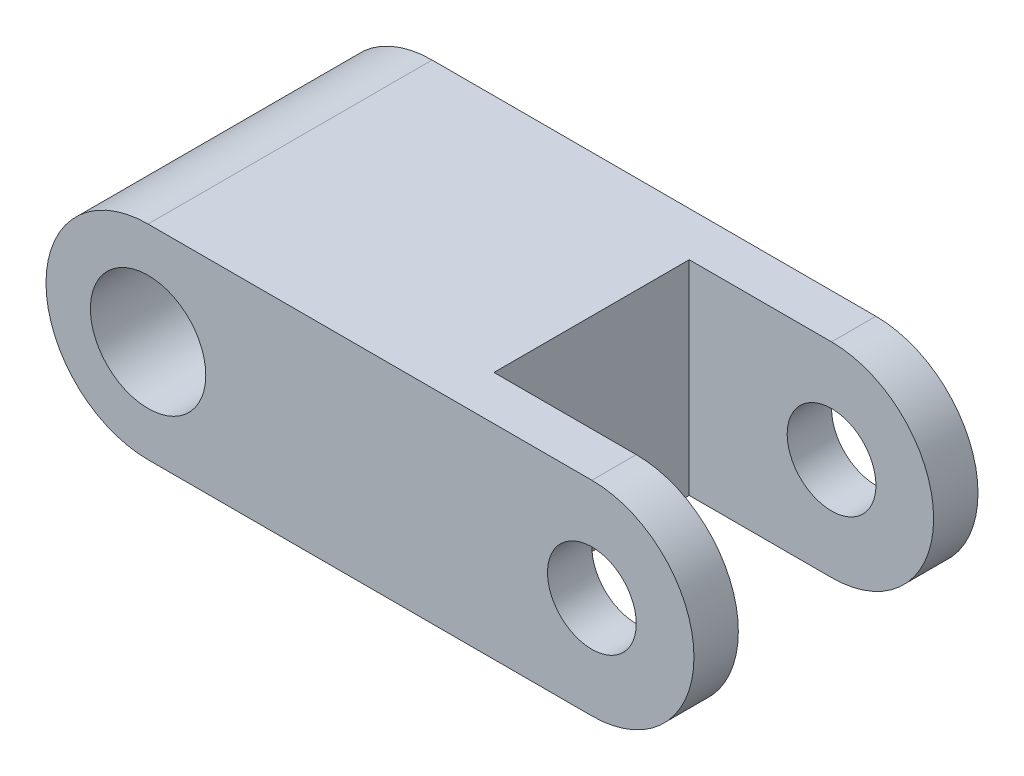
ISO-10303-21;
HEADER;
FILE_DESCRIPTION(('STEP AP214'),'2;1');
FILE_NAME('part.step','',(''),(''),'','','');
FILE_SCHEMA(('AUTOMOTIVE_DESIGN { 1 0 10303 214 1 1 1 1 }'));
ENDSEC;
DATA;
#1=APPLICATION_CONTEXT('core data for automotive mechanical design processes');
#2=APPLICATION_PROTOCOL_DEFINITION('international standard','automotive_design',2000,#1);
#3=PRODUCT_CONTEXT('',#1,'mechanical');
#4=PRODUCT('Part','Part','',(#3));
#5=PRODUCT_RELATED_PRODUCT_CATEGORY('part','',(#4));
#6=PRODUCT_DEFINITION_FORMATION('','',#4);
#7=PRODUCT_DEFINITION_CONTEXT('part definition',#1,'design');
#8=PRODUCT_DEFINITION('design','',#6,#7);
#9=PRODUCT_DEFINITION_SHAPE('','',#8);
#10=(LENGTH_UNIT() NAMED_UNIT(*) SI_UNIT(.MILLI.,.METRE.));
#11=(NAMED_UNIT(*) PLANE_ANGLE_UNIT() SI_UNIT($,.RADIAN.));
#12=(NAMED_UNIT(*) SI_UNIT($,.STERADIAN.) SOLID_ANGLE_UNIT());
#13=UNCERTAINTY_MEASURE_WITH_UNIT(LENGTH_MEASURE(1.E-05),#10,'distance_accuracy_value','');
#14=(GEOMETRIC_REPRESENTATION_CONTEXT(3) GLOBAL_UNCERTAINTY_ASSIGNED_CONTEXT((#13)) GLOBAL_UNIT_ASSIGNED_CONTEXT((#10,
#11,#12)) REPRESENTATION_CONTEXT('',''));
#15=CARTESIAN_POINT('',(0.,0.,0.));
#16=DIRECTION('',(0.,0.,1.));
#17=DIRECTION('',(1.,0.,0.));
#18=AXIS2_PLACEMENT_3D('',#15,#16,#17);
#19=CARTESIAN_POINT('',(50.,0.,32.));
#20=DIRECTION('',(0.,0.,-1.));
#21=DIRECTION('',(-1.,0.,0.));
#22=AXIS2_PLACEMENT_3D('',#19,#20,#21);
#23=CYLINDRICAL_SURFACE('',#22,11.5);
#24=DIRECTION('',(0.,0.,-1.));
#25=VECTOR('',#24,1.);
#26=CARTESIAN_POINT('',(50.,-11.5,32.));
#27=LINE('',#26,#25);
#28=CARTESIAN_POINT('',(50.,-11.5,32.));
#29=VERTEX_POINT('',#28);
#30=CARTESIAN_POINT('',(50.,-11.5,27.));
#31=VERTEX_POINT('',#30);
#32=EDGE_CURVE('E53',#29,#31,#27,.T.);
#33=ORIENTED_EDGE('',*,*,#32,.T.);
#34=CARTESIAN_POINT('',(50.,0.,27.));
#35=DIRECTION('',(0.,0.,1.));
#36=DIRECTION('',(1.,0.,0.));
#37=AXIS2_PLACEMENT_3D('',#34,#35,#36);
#38=CIRCLE('',#37,11.5);
#39=CARTESIAN_POINT('',(50.,11.5,27.));
#40=VERTEX_POINT('',#39);
#41=EDGE_CURVE('E122',#40,#31,#38,.F.);
#42=ORIENTED_EDGE('',*,*,#41,.F.);
#43=DIRECTION('',(0.,0.,-1.));
#44=VECTOR('',#43,1.);
#45=CARTESIAN_POINT('',(50.,11.5,32.));
#46=LINE('',#45,#44);
#47=CARTESIAN_POINT('',(50.,11.5,32.));
#48=VERTEX_POINT('',#47);
#49=EDGE_CURVE('E135',#48,#40,#46,.T.);
#50=ORIENTED_EDGE('',*,*,#49,.F.);
#51=CARTESIAN_POINT('',(50.,0.,32.));
#52=DIRECTION('',(0.,0.,1.));
#53=DIRECTION('',(1.,0.,0.));
#54=AXIS2_PLACEMENT_3D('',#51,#52,#53);
#55=CIRCLE('',#54,11.5);
#56=EDGE_CURVE('E158',#29,#48,#55,.T.);
#57=ORIENTED_EDGE('',*,*,#56,.F.);
#58=EDGE_LOOP('',(#33,#42,#50,#57));
#59=FACE_BOUND('',#58,.T.);
#60=ADVANCED_FACE('F45',(#59),#23,.T.);
#61=CARTESIAN_POINT('',(50.,0.,32.));
#62=DIRECTION('',(0.,0.,-1.));
#63=DIRECTION('',(-1.,0.,0.));
#64=AXIS2_PLACEMENT_3D('',#61,#62,#63);
#65=CYLINDRICAL_SURFACE('',#64,5.);
#66=CARTESIAN_POINT('',(50.,0.,27.));
#67=DIRECTION('',(0.,0.,1.));
#68=DIRECTION('',(1.,0.,0.));
#69=AXIS2_PLACEMENT_3D('',#66,#67,#68);
#70=CIRCLE('',#69,5.);
#71=CARTESIAN_POINT('',(55.,0.,27.));
#72=VERTEX_POINT('',#71);
#73=EDGE_CURVE('E177',#72,#72,#70,.F.);
#74=ORIENTED_EDGE('',*,*,#73,.T.);
#75=EDGE_LOOP('',(#74));
#76=FACE_BOUND('',#75,.T.);
#77=CARTESIAN_POINT('',(50.,0.,32.));
#78=DIRECTION('',(0.,0.,1.));
#79=DIRECTION('',(1.,0.,0.));
#80=AXIS2_PLACEMENT_3D('',#77,#78,#79);
#81=CIRCLE('',#80,5.);
#82=CARTESIAN_POINT('',(55.,0.,32.));
#83=VERTEX_POINT('',#82);
#84=EDGE_CURVE('E165',#83,#83,#81,.T.);
#85=ORIENTED_EDGE('',*,*,#84,.T.);
#86=EDGE_LOOP('',(#85));
#87=FACE_BOUND('',#86,.T.);
#88=ADVANCED_FACE('F192',(#76,#87),#65,.F.);
#89=CARTESIAN_POINT('',(0.,0.,32.));
#90=DIRECTION('',(0.,0.,1.));
#91=DIRECTION('',(1.,0.,0.));
#92=AXIS2_PLACEMENT_3D('',#89,#90,#91);
#93=PLANE('',#92);
#94=CARTESIAN_POINT('',(0.,0.,32.));
#95=DIRECTION('',(0.,0.,1.));
#96=DIRECTION('',(1.,0.,0.));
#97=AXIS2_PLACEMENT_3D('',#94,#95,#96);
#98=CIRCLE('',#97,6.5);
#99=CARTESIAN_POINT('',(6.5,0.,32.));
#100=VERTEX_POINT('',#99);
#101=EDGE_CURVE('E156',#100,#100,#98,.T.);
#102=ORIENTED_EDGE('',*,*,#101,.F.);
#103=EDGE_LOOP('',(#102));
#104=FACE_BOUND('',#103,.T.);
#105=CARTESIAN_POINT('',(0.,0.,32.));
#106=DIRECTION('',(0.,0.,1.));
#107=DIRECTION('',(1.,0.,0.));
#108=AXIS2_PLACEMENT_3D('',#105,#106,#107);
#109=CIRCLE('',#108,11.5);
#110=CARTESIAN_POINT('',(0.,11.5,32.));
#111=VERTEX_POINT('',#110);
#112=CARTESIAN_POINT('',(0.,-11.5,32.));
#113=VERTEX_POINT('',#112);
#114=EDGE_CURVE('E146',#111,#113,#109,.T.);
#115=ORIENTED_EDGE('',*,*,#114,.T.);
#116=DIRECTION('',(1.,0.,0.));
#117=VECTOR('',#116,1.);
#118=CARTESIAN_POINT('',(0.,-11.5,32.));
#119=LINE('',#118,#117);
#120=EDGE_CURVE('E96',#113,#29,#119,.T.);
#121=ORIENTED_EDGE('',*,*,#120,.T.);
#122=ORIENTED_EDGE('',*,*,#56,.T.);
#123=DIRECTION('',(-1.,0.,0.));
#124=VECTOR('',#123,1.);
#125=CARTESIAN_POINT('',(0.,11.5,32.));
#126=LINE('',#125,#124);
#127=EDGE_CURVE('E69',#48,#111,#126,.T.);
#128=ORIENTED_EDGE('',*,*,#127,.T.);
#129=EDGE_LOOP('',(#115,#121,#122,#128));
#130=FACE_BOUND('',#129,.T.);
#131=ORIENTED_EDGE('',*,*,#84,.F.);
#132=EDGE_LOOP('',(#131));
#133=FACE_BOUND('',#132,.T.);
#134=ADVANCED_FACE('F215',(#104,#130,#133),#93,.T.);
#135=CARTESIAN_POINT('',(0.,0.,0.));
#136=DIRECTION('',(0.,0.,1.));
#137=DIRECTION('',(1.,0.,0.));
#138=AXIS2_PLACEMENT_3D('',#135,#136,#137);
#139=PLANE('',#138);
#140=CARTESIAN_POINT('',(0.,0.,0.));
#141=DIRECTION('',(0.,0.,1.));
#142=DIRECTION('',(1.,0.,0.));
#143=AXIS2_PLACEMENT_3D('',#140,#141,#142);
#144=CIRCLE('',#143,11.5);
#145=CARTESIAN_POINT('',(0.,11.5,0.));
#146=VERTEX_POINT('',#145);
#147=CARTESIAN_POINT('',(0.,-11.5,0.));
#148=VERTEX_POINT('',#147);
#149=EDGE_CURVE('E153',#146,#148,#144,.T.);
#150=ORIENTED_EDGE('',*,*,#149,.F.);
#151=DIRECTION('',(-1.,0.,0.));
#152=VECTOR('',#151,1.);
#153=CARTESIAN_POINT('',(0.,11.5,0.));
#154=LINE('',#153,#152);
#155=CARTESIAN_POINT('',(50.,11.5,0.));
#156=VERTEX_POINT('',#155);
#157=EDGE_CURVE('E89',#156,#146,#154,.T.);
#158=ORIENTED_EDGE('',*,*,#157,.F.);
#159=CARTESIAN_POINT('',(50.,0.,0.));
#160=DIRECTION('',(0.,0.,1.));
#161=DIRECTION('',(1.,0.,0.));
#162=AXIS2_PLACEMENT_3D('',#159,#160,#161);
#163=CIRCLE('',#162,11.5);
#164=CARTESIAN_POINT('',(50.,-11.5,0.));
#165=VERTEX_POINT('',#164);
#166=EDGE_CURVE('E147',#165,#156,#163,.T.);
#167=ORIENTED_EDGE('',*,*,#166,.F.);
#168=DIRECTION('',(1.,0.,0.));
#169=VECTOR('',#168,1.);
#170=CARTESIAN_POINT('',(0.,-11.5,0.));
#171=LINE('',#170,#169);
#172=EDGE_CURVE('E150',#148,#165,#171,.T.);
#173=ORIENTED_EDGE('',*,*,#172,.F.);
#174=EDGE_LOOP('',(#150,#158,#167,#173));
#175=FACE_BOUND('',#174,.T.);
#176=CARTESIAN_POINT('',(0.,0.,0.));
#177=DIRECTION('',(0.,0.,1.));
#178=DIRECTION('',(1.,0.,0.));
#179=AXIS2_PLACEMENT_3D('',#176,#177,#178);
#180=CIRCLE('',#179,6.5);
#181=CARTESIAN_POINT('',(6.5,0.,0.));
#182=VERTEX_POINT('',#181);
#183=EDGE_CURVE('E162',#182,#182,#180,.T.);
#184=ORIENTED_EDGE('',*,*,#183,.T.);
#185=EDGE_LOOP('',(#184));
#186=FACE_BOUND('',#185,.T.);
#187=CARTESIAN_POINT('',(50.,0.,0.));
#188=DIRECTION('',(0.,0.,1.));
#189=DIRECTION('',(1.,0.,0.));
#190=AXIS2_PLACEMENT_3D('',#187,#188,#189);
#191=CIRCLE('',#190,5.);
#192=CARTESIAN_POINT('',(55.,0.,0.));
#193=VERTEX_POINT('',#192);
#194=EDGE_CURVE('E168',#193,#193,#191,.T.);
#195=ORIENTED_EDGE('',*,*,#194,.T.);
#196=EDGE_LOOP('',(#195));
#197=FACE_BOUND('',#196,.T.);
#198=ADVANCED_FACE('F232',(#175,#186,#197),#139,.F.);
#199=CARTESIAN_POINT('',(0.,0.,32.));
#200=DIRECTION('',(0.,0.,-1.));
#201=DIRECTION('',(-1.,0.,0.));
#202=AXIS2_PLACEMENT_3D('',#199,#200,#201);
#203=CYLINDRICAL_SURFACE('',#202,11.5);
#204=ORIENTED_EDGE('',*,*,#149,.T.);
#205=DIRECTION('',(0.,0.,-1.));
#206=VECTOR('',#205,1.);
#207=CARTESIAN_POINT('',(0.,-11.5,32.));
#208=LINE('',#207,#206);
#209=EDGE_CURVE('E13',#113,#148,#208,.T.);
#210=ORIENTED_EDGE('',*,*,#209,.F.);
#211=ORIENTED_EDGE('',*,*,#114,.F.);
#212=DIRECTION('',(0.,0.,-1.));
#213=VECTOR('',#212,1.);
#214=CARTESIAN_POINT('',(0.,11.5,32.));
#215=LINE('',#214,#213);
#216=EDGE_CURVE('E142',#111,#146,#215,.T.);
#217=ORIENTED_EDGE('',*,*,#216,.T.);
#218=EDGE_LOOP('',(#204,#210,#211,#217));
#219=FACE_BOUND('',#218,.T.);
#220=ADVANCED_FACE('F47',(#219),#203,.T.);
#221=CARTESIAN_POINT('',(0.,-11.5,32.));
#222=DIRECTION('',(0.,1.,0.));
#223=DIRECTION('',(0.,0.,1.));
#224=AXIS2_PLACEMENT_3D('',#221,#222,#223);
#225=PLANE('',#224);
#226=DIRECTION('',(0.,0.,-1.));
#227=VECTOR('',#226,1.);
#228=CARTESIAN_POINT('',(33.9664567589803,-11.5,5.));
#229=LINE('',#228,#227);
#230=CARTESIAN_POINT('',(33.9664567589803,-11.5,27.));
#231=VERTEX_POINT('',#230);
#232=CARTESIAN_POINT('',(33.9664567589803,-11.5,5.));
#233=VERTEX_POINT('',#232);
#234=EDGE_CURVE('E185',#231,#233,#229,.T.);
#235=ORIENTED_EDGE('',*,*,#234,.F.);
#236=DIRECTION('',(-1.,0.,0.));
#237=VECTOR('',#236,1.);
#238=CARTESIAN_POINT('',(61.5,-11.5,27.));
#239=LINE('',#238,#237);
#240=EDGE_CURVE('E183',#31,#231,#239,.T.);
#241=ORIENTED_EDGE('',*,*,#240,.F.);
#242=ORIENTED_EDGE('',*,*,#32,.F.);
#243=ORIENTED_EDGE('',*,*,#120,.F.);
#244=ORIENTED_EDGE('',*,*,#209,.T.);
#245=ORIENTED_EDGE('',*,*,#172,.T.);
#246=CARTESIAN_POINT('',(50.,-11.5,5.));
#247=VERTEX_POINT('',#246);
#248=EDGE_CURVE('E139',#247,#165,#27,.T.);
#249=ORIENTED_EDGE('',*,*,#248,.F.);
#250=DIRECTION('',(1.,0.,0.));
#251=VECTOR('',#250,1.);
#252=CARTESIAN_POINT('',(61.5,-11.5,5.));
#253=LINE('',#252,#251);
#254=EDGE_CURVE('E171',#233,#247,#253,.T.);
#255=ORIENTED_EDGE('',*,*,#254,.F.);
#256=EDGE_LOOP('',(#235,#241,#242,#243,#244,#245,#249,#255));
#257=FACE_BOUND('',#256,.T.);
#258=ADVANCED_FACE('F218',(#257),#225,.F.);
#259=CARTESIAN_POINT('',(50.,11.5,5.));
#260=VERTEX_POINT('',#259);
#261=EDGE_CURVE('E140',#260,#156,#46,.T.);
#262=ORIENTED_EDGE('',*,*,#261,.F.);
#263=CARTESIAN_POINT('',(50.,0.,5.));
#264=DIRECTION('',(0.,0.,-1.));
#265=DIRECTION('',(-1.,0.,0.));
#266=AXIS2_PLACEMENT_3D('',#263,#264,#265);
#267=CIRCLE('',#266,11.5);
#268=EDGE_CURVE('E60',#247,#260,#267,.F.);
#269=ORIENTED_EDGE('',*,*,#268,.F.);
#270=ORIENTED_EDGE('',*,*,#248,.T.);
#271=ORIENTED_EDGE('',*,*,#166,.T.);
#272=EDGE_LOOP('',(#262,#269,#270,#271));
#273=FACE_BOUND('',#272,.T.);
#274=ADVANCED_FACE('F211',(#273),#23,.T.);
#275=CARTESIAN_POINT('',(0.,11.5,32.));
#276=DIRECTION('',(0.,-1.,0.));
#277=DIRECTION('',(0.,0.,-1.));
#278=AXIS2_PLACEMENT_3D('',#275,#276,#277);
#279=PLANE('',#278);
#280=ORIENTED_EDGE('',*,*,#49,.T.);
#281=DIRECTION('',(1.,0.,0.));
#282=VECTOR('',#281,1.);
#283=CARTESIAN_POINT('',(61.5,11.5,27.));
#284=LINE('',#283,#282);
#285=CARTESIAN_POINT('',(33.9664567589803,11.5,27.));
#286=VERTEX_POINT('',#285);
#287=EDGE_CURVE('E118',#286,#40,#284,.T.);
#288=ORIENTED_EDGE('',*,*,#287,.F.);
#289=DIRECTION('',(0.,0.,1.));
#290=VECTOR('',#289,1.);
#291=CARTESIAN_POINT('',(33.9664567589803,11.5,5.));
#292=LINE('',#291,#290);
#293=CARTESIAN_POINT('',(33.9664567589803,11.5,5.));
#294=VERTEX_POINT('',#293);
#295=EDGE_CURVE('E129',#294,#286,#292,.T.);
#296=ORIENTED_EDGE('',*,*,#295,.F.);
#297=DIRECTION('',(-1.,0.,0.));
#298=VECTOR('',#297,1.);
#299=CARTESIAN_POINT('',(61.5,11.5,5.));
#300=LINE('',#299,#298);
#301=EDGE_CURVE('E181',#260,#294,#300,.T.);
#302=ORIENTED_EDGE('',*,*,#301,.F.);
#303=ORIENTED_EDGE('',*,*,#261,.T.);
#304=ORIENTED_EDGE('',*,*,#157,.T.);
#305=ORIENTED_EDGE('',*,*,#216,.F.);
#306=ORIENTED_EDGE('',*,*,#127,.F.);
#307=EDGE_LOOP('',(#280,#288,#296,#302,#303,#304,#305,#306));
#308=FACE_BOUND('',#307,.T.);
#309=ADVANCED_FACE('F138',(#308),#279,.F.);
#310=CARTESIAN_POINT('',(0.,0.,32.));
#311=DIRECTION('',(0.,0.,-1.));
#312=DIRECTION('',(-1.,0.,0.));
#313=AXIS2_PLACEMENT_3D('',#310,#311,#312);
#314=CYLINDRICAL_SURFACE('',#313,6.5);
#315=ORIENTED_EDGE('',*,*,#101,.T.);
#316=EDGE_LOOP('',(#315));
#317=FACE_BOUND('',#316,.T.);
#318=ORIENTED_EDGE('',*,*,#183,.F.);
#319=EDGE_LOOP('',(#318));
#320=FACE_BOUND('',#319,.T.);
#321=ADVANCED_FACE('F206',(#317,#320),#314,.F.);
#322=CARTESIAN_POINT('',(50.,0.,5.));
#323=DIRECTION('',(0.,0.,-1.));
#324=DIRECTION('',(-1.,0.,0.));
#325=AXIS2_PLACEMENT_3D('',#322,#323,#324);
#326=CIRCLE('',#325,5.);
#327=CARTESIAN_POINT('',(45.,0.,5.));
#328=VERTEX_POINT('',#327);
#329=EDGE_CURVE('E136',#328,#328,#326,.F.);
#330=ORIENTED_EDGE('',*,*,#329,.T.);
#331=EDGE_LOOP('',(#330));
#332=FACE_BOUND('',#331,.T.);
#333=ORIENTED_EDGE('',*,*,#194,.F.);
#334=EDGE_LOOP('',(#333));
#335=FACE_BOUND('',#334,.T.);
#336=ADVANCED_FACE('F197',(#332,#335),#65,.F.);
#337=CARTESIAN_POINT('',(61.5,-11.501,27.));
#338=DIRECTION('',(0.,0.,1.));
#339=DIRECTION('',(1.,0.,0.));
#340=AXIS2_PLACEMENT_3D('',#337,#338,#339);
#341=PLANE('',#340);
#342=ORIENTED_EDGE('',*,*,#73,.F.);
#343=EDGE_LOOP('',(#342));
#344=FACE_BOUND('',#343,.T.);
#345=ORIENTED_EDGE('',*,*,#240,.T.);
#346=DIRECTION('',(0.,1.,0.));
#347=VECTOR('',#346,1.);
#348=CARTESIAN_POINT('',(33.9664567589803,-11.501,27.));
#349=LINE('',#348,#347);
#350=EDGE_CURVE('E124',#231,#286,#349,.T.);
#351=ORIENTED_EDGE('',*,*,#350,.T.);
#352=ORIENTED_EDGE('',*,*,#287,.T.);
#353=ORIENTED_EDGE('',*,*,#41,.T.);
#354=EDGE_LOOP('',(#345,#351,#352,#353));
#355=FACE_BOUND('',#354,.T.);
#356=ADVANCED_FACE('F121',(#344,#355),#341,.F.);
#357=CARTESIAN_POINT('',(33.9664567589803,-11.501,5.));
#358=DIRECTION('',(-1.,0.,0.));
#359=DIRECTION('',(0.,0.,1.));
#360=AXIS2_PLACEMENT_3D('',#357,#358,#359);
#361=PLANE('',#360);
#362=ORIENTED_EDGE('',*,*,#234,.T.);
#363=DIRECTION('',(0.,1.,0.));
#364=VECTOR('',#363,1.);
#365=CARTESIAN_POINT('',(33.9664567589803,-11.501,5.));
#366=LINE('',#365,#364);
#367=EDGE_CURVE('E128',#233,#294,#366,.T.);
#368=ORIENTED_EDGE('',*,*,#367,.T.);
#369=ORIENTED_EDGE('',*,*,#295,.T.);
#370=ORIENTED_EDGE('',*,*,#350,.F.);
#371=EDGE_LOOP('',(#362,#368,#369,#370));
#372=FACE_BOUND('',#371,.T.);
#373=ADVANCED_FACE('F196',(#372),#361,.F.);
#374=CARTESIAN_POINT('',(61.5,-11.501,5.));
#375=DIRECTION('',(0.,0.,-1.));
#376=DIRECTION('',(-1.,0.,0.));
#377=AXIS2_PLACEMENT_3D('',#374,#375,#376);
#378=PLANE('',#377);
#379=ORIENTED_EDGE('',*,*,#329,.F.);
#380=EDGE_LOOP('',(#379));
#381=FACE_BOUND('',#380,.T.);
#382=ORIENTED_EDGE('',*,*,#254,.T.);
#383=ORIENTED_EDGE('',*,*,#268,.T.);
#384=ORIENTED_EDGE('',*,*,#301,.T.);
#385=ORIENTED_EDGE('',*,*,#367,.F.);
#386=EDGE_LOOP('',(#382,#383,#384,#385));
#387=FACE_BOUND('',#386,.T.);
#388=ADVANCED_FACE('F203',(#381,#387),#378,.F.);
#389=CLOSED_SHELL('',(#60,#88,#134,#198,#220,#258,#274,#309,#321,#336,#356,#373,#388));
#390=MANIFOLD_SOLID_BREP('B2',#389);
#391=ADVANCED_BREP_SHAPE_REPRESENTATION('',(#18,#390),#14);
#392=SHAPE_DEFINITION_REPRESENTATION(#9,#391);
ENDSEC;
END-ISO-10303-21;
